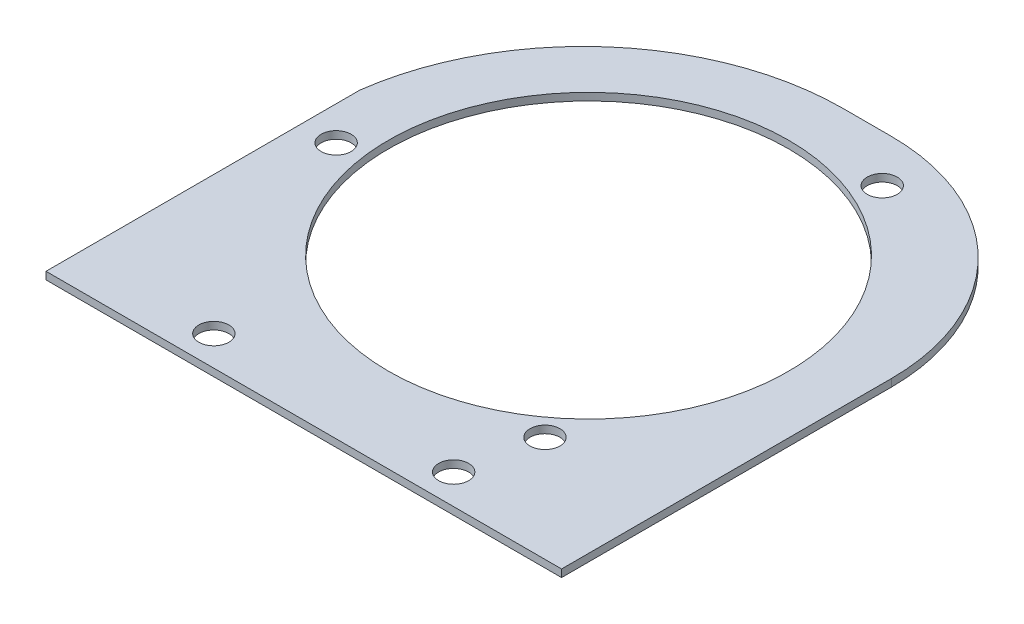
ISO-10303-21;
HEADER;
FILE_DESCRIPTION(('STEP AP214'),'2;1');
FILE_NAME('part.step','',(''),(''),'','','');
FILE_SCHEMA(('AUTOMOTIVE_DESIGN { 1 0 10303 214 1 1 1 1 }'));
ENDSEC;
DATA;
#1=APPLICATION_CONTEXT('core data for automotive mechanical design processes');
#2=APPLICATION_PROTOCOL_DEFINITION('international standard','automotive_design',2000,#1);
#3=PRODUCT_CONTEXT('',#1,'mechanical');
#4=PRODUCT('Part','Part','',(#3));
#5=PRODUCT_RELATED_PRODUCT_CATEGORY('part','',(#4));
#6=PRODUCT_DEFINITION_FORMATION('','',#4);
#7=PRODUCT_DEFINITION_CONTEXT('part definition',#1,'design');
#8=PRODUCT_DEFINITION('design','',#6,#7);
#9=PRODUCT_DEFINITION_SHAPE('','',#8);
#10=(LENGTH_UNIT() NAMED_UNIT(*) SI_UNIT(.MILLI.,.METRE.));
#11=(NAMED_UNIT(*) PLANE_ANGLE_UNIT() SI_UNIT($,.RADIAN.));
#12=(NAMED_UNIT(*) SI_UNIT($,.STERADIAN.) SOLID_ANGLE_UNIT());
#13=UNCERTAINTY_MEASURE_WITH_UNIT(LENGTH_MEASURE(1.E-05),#10,'distance_accuracy_value','');
#14=(GEOMETRIC_REPRESENTATION_CONTEXT(3) GLOBAL_UNCERTAINTY_ASSIGNED_CONTEXT((#13)) GLOBAL_UNIT_ASSIGNED_CONTEXT((#10,
#11,#12)) REPRESENTATION_CONTEXT('',''));
#15=CARTESIAN_POINT('',(0.,0.,0.));
#16=DIRECTION('',(0.,0.,1.));
#17=DIRECTION('',(1.,0.,0.));
#18=AXIS2_PLACEMENT_3D('',#15,#16,#17);
#19=CARTESIAN_POINT('',(16.7516707964213,3.175,-21.6657019962549));
#20=DIRECTION('',(0.,-1.,0.));
#21=DIRECTION('',(0.,0.,-1.));
#22=AXIS2_PLACEMENT_3D('',#19,#20,#21);
#23=PLANE('',#22);
#24=DIRECTION('',(0.,0.,1.));
#25=VECTOR('',#24,1.);
#26=CARTESIAN_POINT('',(-112.788329203579,3.175,-14.9421725844915));
#27=LINE('',#26,#25);
#28=CARTESIAN_POINT('',(-112.788329203579,3.175,-14.9421725844916));
#29=VERTEX_POINT('',#28);
#30=CARTESIAN_POINT('',(-112.788329203579,3.175,118.034298003745));
#31=VERTEX_POINT('',#30);
#32=EDGE_CURVE('E131',#29,#31,#27,.T.);
#33=ORIENTED_EDGE('',*,*,#32,.T.);
#34=DIRECTION('',(1.,0.,0.));
#35=VECTOR('',#34,1.);
#36=CARTESIAN_POINT('',(105.651670796421,3.175,118.034298003745));
#37=LINE('',#36,#35);
#38=CARTESIAN_POINT('',(105.651670796421,3.175,118.034298003745));
#39=VERTEX_POINT('',#38);
#40=EDGE_CURVE('E89',#31,#39,#37,.T.);
#41=ORIENTED_EDGE('',*,*,#40,.T.);
#42=DIRECTION('',(0.,0.,-1.));
#43=VECTOR('',#42,1.);
#44=CARTESIAN_POINT('',(105.651670796421,3.175,-21.6657019962549));
#45=LINE('',#44,#43);
#46=CARTESIAN_POINT('',(105.651670796421,3.175,-21.6657019962549));
#47=VERTEX_POINT('',#46);
#48=EDGE_CURVE('E102',#39,#47,#45,.T.);
#49=ORIENTED_EDGE('',*,*,#48,.T.);
#50=CARTESIAN_POINT('',(16.7516707964213,3.175,-21.6657019962549));
#51=DIRECTION('',(0.,1.,0.));
#52=DIRECTION('',(0.,0.,-1.));
#53=AXIS2_PLACEMENT_3D('',#50,#51,#52);
#54=CIRCLE('',#53,88.9);
#55=CARTESIAN_POINT('',(16.7516707964213,3.175,-110.565701996255));
#56=VERTEX_POINT('',#55);
#57=EDGE_CURVE('E96',#47,#56,#54,.T.);
#58=ORIENTED_EDGE('',*,*,#57,.T.);
#59=DIRECTION('',(-1.,0.,0.));
#60=VECTOR('',#59,1.);
#61=CARTESIAN_POINT('',(16.7516707964213,3.175,-110.565701996255));
#62=LINE('',#61,#60);
#63=CARTESIAN_POINT('',(-3.56832920357874,3.175,-110.565701996255));
#64=VERTEX_POINT('',#63);
#65=EDGE_CURVE('E100',#56,#64,#62,.T.);
#66=ORIENTED_EDGE('',*,*,#65,.T.);
#67=CARTESIAN_POINT('',(-3.56832920357873,3.175,-0.379077915372299));
#68=DIRECTION('',(0.,1.,0.));
#69=DIRECTION('',(0.,0.,1.));
#70=AXIS2_PLACEMENT_3D('',#67,#68,#69);
#71=CIRCLE('',#70,110.186624080883);
#72=EDGE_CURVE('E52',#64,#29,#71,.T.);
#73=ORIENTED_EDGE('',*,*,#72,.T.);
#74=EDGE_LOOP('',(#33,#41,#49,#58,#66,#73));
#75=FACE_BOUND('',#74,.T.);
#76=CARTESIAN_POINT('',(-3.56832920357873,3.175,-2.61570199625484));
#77=DIRECTION('',(0.,1.,0.));
#78=DIRECTION('',(0.,0.,1.));
#79=AXIS2_PLACEMENT_3D('',#76,#77,#78);
#80=CIRCLE('',#79,84.7725);
#81=CARTESIAN_POINT('',(-3.56832920357873,3.175,82.1567980037452));
#82=VERTEX_POINT('',#81);
#83=EDGE_CURVE('E124',#82,#82,#80,.T.);
#84=ORIENTED_EDGE('',*,*,#83,.F.);
#85=EDGE_LOOP('',(#84));
#86=FACE_BOUND('',#85,.T.);
#87=CARTESIAN_POINT('',(-98.4364962880711,3.175,9.4505450612446));
#88=DIRECTION('',(0.,1.,0.));
#89=DIRECTION('',(0.,0.,1.));
#90=AXIS2_PLACEMENT_3D('',#87,#88,#89);
#91=CIRCLE('',#90,6.35);
#92=CARTESIAN_POINT('',(-98.4364962880711,3.175,15.8005450612446));
#93=VERTEX_POINT('',#92);
#94=EDGE_CURVE('E215',#93,#93,#91,.T.);
#95=ORIENTED_EDGE('',*,*,#94,.F.);
#96=EDGE_LOOP('',(#95));
#97=FACE_BOUND('',#96,.T.);
#98=CARTESIAN_POINT('',(-54.3683292035787,3.175,105.334298003745));
#99=DIRECTION('',(0.,1.,0.));
#100=DIRECTION('',(0.,0.,1.));
#101=AXIS2_PLACEMENT_3D('',#98,#99,#100);
#102=CIRCLE('',#101,6.35);
#103=CARTESIAN_POINT('',(-54.3683292035787,3.175,111.684298003745));
#104=VERTEX_POINT('',#103);
#105=EDGE_CURVE('E209',#104,#104,#102,.T.);
#106=ORIENTED_EDGE('',*,*,#105,.F.);
#107=EDGE_LOOP('',(#106));
#108=FACE_BOUND('',#107,.T.);
#109=CARTESIAN_POINT('',(47.2316707964213,3.175,105.334298003745));
#110=DIRECTION('',(0.,1.,0.));
#111=DIRECTION('',(0.,0.,-1.));
#112=AXIS2_PLACEMENT_3D('',#109,#110,#111);
#113=CIRCLE('',#112,6.35);
#114=CARTESIAN_POINT('',(47.2316707964213,3.175,98.9842980037452));
#115=VERTEX_POINT('',#114);
#116=EDGE_CURVE('E203',#115,#115,#113,.T.);
#117=ORIENTED_EDGE('',*,*,#116,.F.);
#118=EDGE_LOOP('',(#117));
#119=FACE_BOUND('',#118,.T.);
#120=CARTESIAN_POINT('',(32.9548211112837,3.175,-90.5211094817406));
#121=DIRECTION('',(0.,1.,0.));
#122=DIRECTION('',(0.,0.,1.));
#123=AXIS2_PLACEMENT_3D('',#120,#121,#122);
#124=CIRCLE('',#123,6.34999999999999);
#125=CARTESIAN_POINT('',(32.9548211112837,3.175,-84.1711094817406));
#126=VERTEX_POINT('',#125);
#127=EDGE_CURVE('E197',#126,#126,#124,.T.);
#128=ORIENTED_EDGE('',*,*,#127,.F.);
#129=EDGE_LOOP('',(#128));
#130=FACE_BOUND('',#129,.T.);
#131=CARTESIAN_POINT('',(53.8371549041935,3.175,73.2529364942977));
#132=DIRECTION('',(0.,1.,0.));
#133=DIRECTION('',(0.,0.,1.));
#134=AXIS2_PLACEMENT_3D('',#131,#132,#133);
#135=CIRCLE('',#134,6.34999999999999);
#136=CARTESIAN_POINT('',(53.8371549041935,3.175,79.6029364942977));
#137=VERTEX_POINT('',#136);
#138=EDGE_CURVE('E188',#137,#137,#135,.T.);
#139=ORIENTED_EDGE('',*,*,#138,.F.);
#140=EDGE_LOOP('',(#139));
#141=FACE_BOUND('',#140,.T.);
#142=ADVANCED_FACE('F35',(#75,#86,#97,#108,#119,#130,#141),#23,.F.);
#143=CARTESIAN_POINT('',(16.7516707964213,0.,-21.6657019962549));
#144=DIRECTION('',(0.,-1.,0.));
#145=DIRECTION('',(0.,0.,-1.));
#146=AXIS2_PLACEMENT_3D('',#143,#144,#145);
#147=PLANE('',#146);
#148=CARTESIAN_POINT('',(32.9548211112837,0.,-90.5211094817406));
#149=DIRECTION('',(0.,1.,0.));
#150=DIRECTION('',(0.,0.,1.));
#151=AXIS2_PLACEMENT_3D('',#148,#149,#150);
#152=CIRCLE('',#151,6.34999999999999);
#153=CARTESIAN_POINT('',(32.9548211112837,0.,-84.1711094817406));
#154=VERTEX_POINT('',#153);
#155=EDGE_CURVE('E194',#154,#154,#152,.T.);
#156=ORIENTED_EDGE('',*,*,#155,.T.);
#157=EDGE_LOOP('',(#156));
#158=FACE_BOUND('',#157,.T.);
#159=CARTESIAN_POINT('',(-54.3683292035787,0.,105.334298003745));
#160=DIRECTION('',(0.,1.,0.));
#161=DIRECTION('',(0.,0.,1.));
#162=AXIS2_PLACEMENT_3D('',#159,#160,#161);
#163=CIRCLE('',#162,6.35);
#164=CARTESIAN_POINT('',(-54.3683292035787,0.,111.684298003745));
#165=VERTEX_POINT('',#164);
#166=EDGE_CURVE('E206',#165,#165,#163,.T.);
#167=ORIENTED_EDGE('',*,*,#166,.T.);
#168=EDGE_LOOP('',(#167));
#169=FACE_BOUND('',#168,.T.);
#170=CARTESIAN_POINT('',(-3.56832920357873,0.,-2.61570199625484));
#171=DIRECTION('',(0.,1.,0.));
#172=DIRECTION('',(0.,0.,1.));
#173=AXIS2_PLACEMENT_3D('',#170,#171,#172);
#174=CIRCLE('',#173,84.7725);
#175=CARTESIAN_POINT('',(-3.56832920357873,0.,82.1567980037452));
#176=VERTEX_POINT('',#175);
#177=EDGE_CURVE('E218',#176,#176,#174,.T.);
#178=ORIENTED_EDGE('',*,*,#177,.T.);
#179=EDGE_LOOP('',(#178));
#180=FACE_BOUND('',#179,.T.);
#181=DIRECTION('',(0.,0.,1.));
#182=VECTOR('',#181,1.);
#183=CARTESIAN_POINT('',(-112.788329203579,0.,-14.9421725844915));
#184=LINE('',#183,#182);
#185=CARTESIAN_POINT('',(-112.788329203579,0.,-14.9421725844916));
#186=VERTEX_POINT('',#185);
#187=CARTESIAN_POINT('',(-112.788329203579,0.,118.034298003745));
#188=VERTEX_POINT('',#187);
#189=EDGE_CURVE('E120',#186,#188,#184,.T.);
#190=ORIENTED_EDGE('',*,*,#189,.F.);
#191=CARTESIAN_POINT('',(-3.56832920357873,0.,-0.379077915372299));
#192=DIRECTION('',(0.,1.,0.));
#193=DIRECTION('',(0.,0.,1.));
#194=AXIS2_PLACEMENT_3D('',#191,#192,#193);
#195=CIRCLE('',#194,110.186624080883);
#196=CARTESIAN_POINT('',(-3.56832920357874,0.,-110.565701996255));
#197=VERTEX_POINT('',#196);
#198=EDGE_CURVE('E81',#197,#186,#195,.T.);
#199=ORIENTED_EDGE('',*,*,#198,.F.);
#200=DIRECTION('',(-1.,0.,0.));
#201=VECTOR('',#200,1.);
#202=CARTESIAN_POINT('',(16.7516707964213,0.,-110.565701996255));
#203=LINE('',#202,#201);
#204=CARTESIAN_POINT('',(16.7516707964213,0.,-110.565701996255));
#205=VERTEX_POINT('',#204);
#206=EDGE_CURVE('E75',#205,#197,#203,.T.);
#207=ORIENTED_EDGE('',*,*,#206,.F.);
#208=CARTESIAN_POINT('',(16.7516707964213,0.,-21.6657019962549));
#209=DIRECTION('',(0.,1.,0.));
#210=DIRECTION('',(0.,0.,-1.));
#211=AXIS2_PLACEMENT_3D('',#208,#209,#210);
#212=CIRCLE('',#211,88.9);
#213=CARTESIAN_POINT('',(105.651670796421,0.,-21.6657019962549));
#214=VERTEX_POINT('',#213);
#215=EDGE_CURVE('E110',#214,#205,#212,.T.);
#216=ORIENTED_EDGE('',*,*,#215,.F.);
#217=DIRECTION('',(0.,0.,-1.));
#218=VECTOR('',#217,1.);
#219=CARTESIAN_POINT('',(105.651670796421,0.,-21.6657019962549));
#220=LINE('',#219,#218);
#221=CARTESIAN_POINT('',(105.651670796421,0.,118.034298003745));
#222=VERTEX_POINT('',#221);
#223=EDGE_CURVE('E126',#222,#214,#220,.T.);
#224=ORIENTED_EDGE('',*,*,#223,.F.);
#225=DIRECTION('',(1.,0.,0.));
#226=VECTOR('',#225,1.);
#227=CARTESIAN_POINT('',(105.651670796421,0.,118.034298003745));
#228=LINE('',#227,#226);
#229=EDGE_CURVE('E123',#188,#222,#228,.T.);
#230=ORIENTED_EDGE('',*,*,#229,.F.);
#231=EDGE_LOOP('',(#190,#199,#207,#216,#224,#230));
#232=FACE_BOUND('',#231,.T.);
#233=CARTESIAN_POINT('',(-98.4364962880711,0.,9.4505450612446));
#234=DIRECTION('',(0.,1.,0.));
#235=DIRECTION('',(0.,0.,1.));
#236=AXIS2_PLACEMENT_3D('',#233,#234,#235);
#237=CIRCLE('',#236,6.35);
#238=CARTESIAN_POINT('',(-98.4364962880711,0.,15.8005450612446));
#239=VERTEX_POINT('',#238);
#240=EDGE_CURVE('E212',#239,#239,#237,.T.);
#241=ORIENTED_EDGE('',*,*,#240,.T.);
#242=EDGE_LOOP('',(#241));
#243=FACE_BOUND('',#242,.T.);
#244=CARTESIAN_POINT('',(47.2316707964213,0.,105.334298003745));
#245=DIRECTION('',(0.,1.,0.));
#246=DIRECTION('',(0.,0.,-1.));
#247=AXIS2_PLACEMENT_3D('',#244,#245,#246);
#248=CIRCLE('',#247,6.35);
#249=CARTESIAN_POINT('',(47.2316707964213,0.,98.9842980037452));
#250=VERTEX_POINT('',#249);
#251=EDGE_CURVE('E200',#250,#250,#248,.T.);
#252=ORIENTED_EDGE('',*,*,#251,.T.);
#253=EDGE_LOOP('',(#252));
#254=FACE_BOUND('',#253,.T.);
#255=CARTESIAN_POINT('',(53.8371549041935,0.,73.2529364942977));
#256=DIRECTION('',(0.,1.,0.));
#257=DIRECTION('',(0.,0.,1.));
#258=AXIS2_PLACEMENT_3D('',#255,#256,#257);
#259=CIRCLE('',#258,6.34999999999999);
#260=CARTESIAN_POINT('',(53.8371549041935,0.,79.6029364942977));
#261=VERTEX_POINT('',#260);
#262=EDGE_CURVE('E191',#261,#261,#259,.T.);
#263=ORIENTED_EDGE('',*,*,#262,.T.);
#264=EDGE_LOOP('',(#263));
#265=FACE_BOUND('',#264,.T.);
#266=ADVANCED_FACE('F140',(#158,#169,#180,#232,#243,#254,#265),#147,.T.);
#267=CARTESIAN_POINT('',(-112.788329203579,3.175,-14.9421725844915));
#268=DIRECTION('',(1.,0.,0.));
#269=DIRECTION('',(0.,0.,-1.));
#270=AXIS2_PLACEMENT_3D('',#267,#268,#269);
#271=PLANE('',#270);
#272=ORIENTED_EDGE('',*,*,#189,.T.);
#273=DIRECTION('',(0.,-1.,0.));
#274=VECTOR('',#273,1.);
#275=CARTESIAN_POINT('',(-112.788329203579,3.175,118.034298003745));
#276=LINE('',#275,#274);
#277=EDGE_CURVE('E11',#31,#188,#276,.T.);
#278=ORIENTED_EDGE('',*,*,#277,.F.);
#279=ORIENTED_EDGE('',*,*,#32,.F.);
#280=DIRECTION('',(0.,-1.,0.));
#281=VECTOR('',#280,1.);
#282=CARTESIAN_POINT('',(-112.788329203579,3.175,-14.9421725844916));
#283=LINE('',#282,#281);
#284=EDGE_CURVE('E116',#29,#186,#283,.T.);
#285=ORIENTED_EDGE('',*,*,#284,.T.);
#286=EDGE_LOOP('',(#272,#278,#279,#285));
#287=FACE_BOUND('',#286,.T.);
#288=ADVANCED_FACE('F37',(#287),#271,.F.);
#289=CARTESIAN_POINT('',(105.651670796421,3.175,118.034298003745));
#290=DIRECTION('',(0.,0.,-1.));
#291=DIRECTION('',(-1.,0.,0.));
#292=AXIS2_PLACEMENT_3D('',#289,#290,#291);
#293=PLANE('',#292);
#294=ORIENTED_EDGE('',*,*,#229,.T.);
#295=DIRECTION('',(0.,-1.,0.));
#296=VECTOR('',#295,1.);
#297=CARTESIAN_POINT('',(105.651670796421,3.175,118.034298003745));
#298=LINE('',#297,#296);
#299=EDGE_CURVE('E44',#39,#222,#298,.T.);
#300=ORIENTED_EDGE('',*,*,#299,.F.);
#301=ORIENTED_EDGE('',*,*,#40,.F.);
#302=ORIENTED_EDGE('',*,*,#277,.T.);
#303=EDGE_LOOP('',(#294,#300,#301,#302));
#304=FACE_BOUND('',#303,.T.);
#305=ADVANCED_FACE('F296',(#304),#293,.F.);
#306=CARTESIAN_POINT('',(105.651670796421,3.175,-21.6657019962549));
#307=DIRECTION('',(-1.,0.,0.));
#308=DIRECTION('',(0.,0.,1.));
#309=AXIS2_PLACEMENT_3D('',#306,#307,#308);
#310=PLANE('',#309);
#311=ORIENTED_EDGE('',*,*,#223,.T.);
#312=DIRECTION('',(0.,-1.,0.));
#313=VECTOR('',#312,1.);
#314=CARTESIAN_POINT('',(105.651670796421,3.175,-21.6657019962549));
#315=LINE('',#314,#313);
#316=EDGE_CURVE('E111',#47,#214,#315,.T.);
#317=ORIENTED_EDGE('',*,*,#316,.F.);
#318=ORIENTED_EDGE('',*,*,#48,.F.);
#319=ORIENTED_EDGE('',*,*,#299,.T.);
#320=EDGE_LOOP('',(#311,#317,#318,#319));
#321=FACE_BOUND('',#320,.T.);
#322=ADVANCED_FACE('F137',(#321),#310,.F.);
#323=CARTESIAN_POINT('',(16.7516707964213,3.175,-21.6657019962549));
#324=DIRECTION('',(0.,-1.,0.));
#325=DIRECTION('',(0.,0.,-1.));
#326=AXIS2_PLACEMENT_3D('',#323,#324,#325);
#327=CYLINDRICAL_SURFACE('',#326,88.9);
#328=ORIENTED_EDGE('',*,*,#215,.T.);
#329=DIRECTION('',(0.,-1.,0.));
#330=VECTOR('',#329,1.);
#331=CARTESIAN_POINT('',(16.7516707964213,3.175,-110.565701996255));
#332=LINE('',#331,#330);
#333=EDGE_CURVE('E107',#56,#205,#332,.T.);
#334=ORIENTED_EDGE('',*,*,#333,.F.);
#335=ORIENTED_EDGE('',*,*,#57,.F.);
#336=ORIENTED_EDGE('',*,*,#316,.T.);
#337=EDGE_LOOP('',(#328,#334,#335,#336));
#338=FACE_BOUND('',#337,.T.);
#339=ADVANCED_FACE('F108',(#338),#327,.T.);
#340=CARTESIAN_POINT('',(16.7516707964213,3.175,-110.565701996255));
#341=DIRECTION('',(0.,0.,1.));
#342=DIRECTION('',(1.,0.,0.));
#343=AXIS2_PLACEMENT_3D('',#340,#341,#342);
#344=PLANE('',#343);
#345=ORIENTED_EDGE('',*,*,#206,.T.);
#346=DIRECTION('',(0.,-1.,0.));
#347=VECTOR('',#346,1.);
#348=CARTESIAN_POINT('',(-3.56832920357874,3.175,-110.565701996255));
#349=LINE('',#348,#347);
#350=EDGE_CURVE('E112',#64,#197,#349,.T.);
#351=ORIENTED_EDGE('',*,*,#350,.F.);
#352=ORIENTED_EDGE('',*,*,#65,.F.);
#353=ORIENTED_EDGE('',*,*,#333,.T.);
#354=EDGE_LOOP('',(#345,#351,#352,#353));
#355=FACE_BOUND('',#354,.T.);
#356=ADVANCED_FACE('F114',(#355),#344,.F.);
#357=CARTESIAN_POINT('',(-3.56832920357873,3.175,-0.379077915372299));
#358=DIRECTION('',(0.,-1.,0.));
#359=DIRECTION('',(0.,0.,-1.));
#360=AXIS2_PLACEMENT_3D('',#357,#358,#359);
#361=CYLINDRICAL_SURFACE('',#360,110.186624080883);
#362=ORIENTED_EDGE('',*,*,#198,.T.);
#363=ORIENTED_EDGE('',*,*,#284,.F.);
#364=ORIENTED_EDGE('',*,*,#72,.F.);
#365=ORIENTED_EDGE('',*,*,#350,.T.);
#366=EDGE_LOOP('',(#362,#363,#364,#365));
#367=FACE_BOUND('',#366,.T.);
#368=ADVANCED_FACE('F145',(#367),#361,.T.);
#369=CARTESIAN_POINT('',(-3.56832920357873,3.175,-2.61570199625484));
#370=DIRECTION('',(0.,-1.,0.));
#371=DIRECTION('',(0.,0.,-1.));
#372=AXIS2_PLACEMENT_3D('',#369,#370,#371);
#373=CYLINDRICAL_SURFACE('',#372,84.7725);
#374=ORIENTED_EDGE('',*,*,#83,.T.);
#375=EDGE_LOOP('',(#374));
#376=FACE_BOUND('',#375,.T.);
#377=ORIENTED_EDGE('',*,*,#177,.F.);
#378=EDGE_LOOP('',(#377));
#379=FACE_BOUND('',#378,.T.);
#380=ADVANCED_FACE('F147',(#376,#379),#373,.F.);
#381=CARTESIAN_POINT('',(-98.4364962880711,3.175,9.4505450612446));
#382=DIRECTION('',(0.,-1.,0.));
#383=DIRECTION('',(0.,0.,-1.));
#384=AXIS2_PLACEMENT_3D('',#381,#382,#383);
#385=CYLINDRICAL_SURFACE('',#384,6.35);
#386=ORIENTED_EDGE('',*,*,#94,.T.);
#387=EDGE_LOOP('',(#386));
#388=FACE_BOUND('',#387,.T.);
#389=ORIENTED_EDGE('',*,*,#240,.F.);
#390=EDGE_LOOP('',(#389));
#391=FACE_BOUND('',#390,.T.);
#392=ADVANCED_FACE('F153',(#388,#391),#385,.F.);
#393=CARTESIAN_POINT('',(-54.3683292035787,3.175,105.334298003745));
#394=DIRECTION('',(0.,-1.,0.));
#395=DIRECTION('',(0.,0.,-1.));
#396=AXIS2_PLACEMENT_3D('',#393,#394,#395);
#397=CYLINDRICAL_SURFACE('',#396,6.35);
#398=ORIENTED_EDGE('',*,*,#105,.T.);
#399=EDGE_LOOP('',(#398));
#400=FACE_BOUND('',#399,.T.);
#401=ORIENTED_EDGE('',*,*,#166,.F.);
#402=EDGE_LOOP('',(#401));
#403=FACE_BOUND('',#402,.T.);
#404=ADVANCED_FACE('F167',(#400,#403),#397,.F.);
#405=CARTESIAN_POINT('',(47.2316707964213,3.175,105.334298003745));
#406=DIRECTION('',(0.,-1.,0.));
#407=DIRECTION('',(0.,0.,-1.));
#408=AXIS2_PLACEMENT_3D('',#405,#406,#407);
#409=CYLINDRICAL_SURFACE('',#408,6.35);
#410=ORIENTED_EDGE('',*,*,#116,.T.);
#411=EDGE_LOOP('',(#410));
#412=FACE_BOUND('',#411,.T.);
#413=ORIENTED_EDGE('',*,*,#251,.F.);
#414=EDGE_LOOP('',(#413));
#415=FACE_BOUND('',#414,.T.);
#416=ADVANCED_FACE('F171',(#412,#415),#409,.F.);
#417=CARTESIAN_POINT('',(32.9548211112837,3.175,-90.5211094817406));
#418=DIRECTION('',(0.,-1.,0.));
#419=DIRECTION('',(0.,0.,-1.));
#420=AXIS2_PLACEMENT_3D('',#417,#418,#419);
#421=CYLINDRICAL_SURFACE('',#420,6.34999999999999);
#422=ORIENTED_EDGE('',*,*,#127,.T.);
#423=EDGE_LOOP('',(#422));
#424=FACE_BOUND('',#423,.T.);
#425=ORIENTED_EDGE('',*,*,#155,.F.);
#426=EDGE_LOOP('',(#425));
#427=FACE_BOUND('',#426,.T.);
#428=ADVANCED_FACE('F175',(#424,#427),#421,.F.);
#429=CARTESIAN_POINT('',(53.8371549041935,3.175,73.2529364942977));
#430=DIRECTION('',(0.,-1.,0.));
#431=DIRECTION('',(0.,0.,-1.));
#432=AXIS2_PLACEMENT_3D('',#429,#430,#431);
#433=CYLINDRICAL_SURFACE('',#432,6.34999999999999);
#434=ORIENTED_EDGE('',*,*,#138,.T.);
#435=EDGE_LOOP('',(#434));
#436=FACE_BOUND('',#435,.T.);
#437=ORIENTED_EDGE('',*,*,#262,.F.);
#438=EDGE_LOOP('',(#437));
#439=FACE_BOUND('',#438,.T.);
#440=ADVANCED_FACE('F179',(#436,#439),#433,.F.);
#441=CLOSED_SHELL('',(#142,#266,#288,#305,#322,#339,#356,#368,#380,#392,#404,#416,#428,#440));
#442=MANIFOLD_SOLID_BREP('B2',#441);
#443=ADVANCED_BREP_SHAPE_REPRESENTATION('',(#18,#442),#14);
#444=SHAPE_DEFINITION_REPRESENTATION(#9,#443);
ENDSEC;
END-ISO-10303-21;
